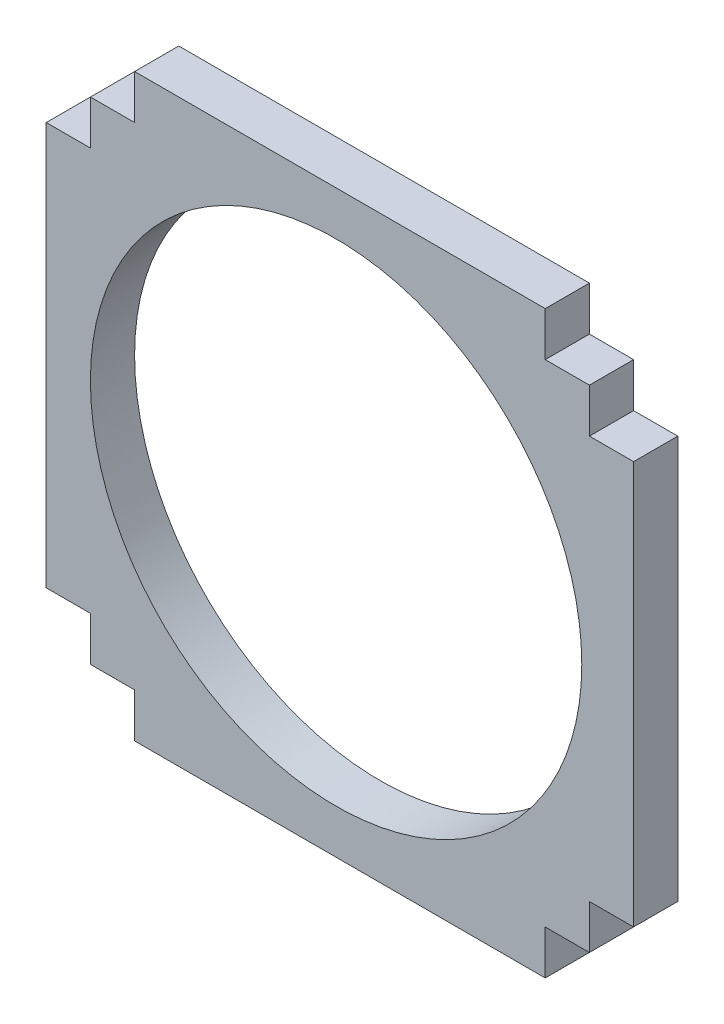
ISO-10303-21;
HEADER;
FILE_DESCRIPTION(('STEP AP214'),'2;1');
FILE_NAME('part.step','',(''),(''),'','','');
FILE_SCHEMA(('AUTOMOTIVE_DESIGN { 1 0 10303 214 1 1 1 1 }'));
ENDSEC;
DATA;
#1=APPLICATION_CONTEXT('core data for automotive mechanical design processes');
#2=APPLICATION_PROTOCOL_DEFINITION('international standard','automotive_design',2000,#1);
#3=PRODUCT_CONTEXT('',#1,'mechanical');
#4=PRODUCT('Part','Part','',(#3));
#5=PRODUCT_RELATED_PRODUCT_CATEGORY('part','',(#4));
#6=PRODUCT_DEFINITION_FORMATION('','',#4);
#7=PRODUCT_DEFINITION_CONTEXT('part definition',#1,'design');
#8=PRODUCT_DEFINITION('design','',#6,#7);
#9=PRODUCT_DEFINITION_SHAPE('','',#8);
#10=(LENGTH_UNIT() NAMED_UNIT(*) SI_UNIT(.MILLI.,.METRE.));
#11=(NAMED_UNIT(*) PLANE_ANGLE_UNIT() SI_UNIT($,.RADIAN.));
#12=(NAMED_UNIT(*) SI_UNIT($,.STERADIAN.) SOLID_ANGLE_UNIT());
#13=UNCERTAINTY_MEASURE_WITH_UNIT(LENGTH_MEASURE(1.E-05),#10,'distance_accuracy_value','');
#14=(GEOMETRIC_REPRESENTATION_CONTEXT(3) GLOBAL_UNCERTAINTY_ASSIGNED_CONTEXT((#13)) GLOBAL_UNIT_ASSIGNED_CONTEXT((#10,
#11,#12)) REPRESENTATION_CONTEXT('',''));
#15=CARTESIAN_POINT('',(0.,0.,0.));
#16=DIRECTION('',(0.,0.,1.));
#17=DIRECTION('',(1.,0.,0.));
#18=AXIS2_PLACEMENT_3D('',#15,#16,#17);
#19=CARTESIAN_POINT('',(36.4109,35.3139375,-6.35));
#20=DIRECTION('',(1.,0.,0.));
#21=DIRECTION('',(0.,0.,-1.));
#22=AXIS2_PLACEMENT_3D('',#19,#20,#21);
#23=PLANE('',#22);
#24=DIRECTION('',(0.,1.,0.));
#25=VECTOR('',#24,1.);
#26=CARTESIAN_POINT('',(36.4109,35.3139375,0.));
#27=LINE('',#26,#25);
#28=CARTESIAN_POINT('',(36.4109,28.9639375,0.));
#29=VERTEX_POINT('',#28);
#30=CARTESIAN_POINT('',(36.4109,35.3139375,0.));
#31=VERTEX_POINT('',#30);
#32=EDGE_CURVE('E204',#29,#31,#27,.T.);
#33=ORIENTED_EDGE('',*,*,#32,.F.);
#34=DIRECTION('',(0.,0.,1.));
#35=VECTOR('',#34,1.);
#36=CARTESIAN_POINT('',(36.4109,28.9639375,-6.35));
#37=LINE('',#36,#35);
#38=CARTESIAN_POINT('',(36.4109,28.9639375,-6.35));
#39=VERTEX_POINT('',#38);
#40=EDGE_CURVE('E11',#39,#29,#37,.T.);
#41=ORIENTED_EDGE('',*,*,#40,.F.);
#42=DIRECTION('',(0.,1.,0.));
#43=VECTOR('',#42,1.);
#44=CARTESIAN_POINT('',(36.4109,35.3139375,-6.35));
#45=LINE('',#44,#43);
#46=CARTESIAN_POINT('',(36.4109,35.3139375,-6.35));
#47=VERTEX_POINT('',#46);
#48=EDGE_CURVE('E261',#39,#47,#45,.T.);
#49=ORIENTED_EDGE('',*,*,#48,.T.);
#50=DIRECTION('',(0.,0.,1.));
#51=VECTOR('',#50,1.);
#52=CARTESIAN_POINT('',(36.4109,35.3139375,-6.35));
#53=LINE('',#52,#51);
#54=EDGE_CURVE('E38',#47,#31,#53,.T.);
#55=ORIENTED_EDGE('',*,*,#54,.T.);
#56=EDGE_LOOP('',(#33,#41,#49,#55));
#57=FACE_BOUND('',#56,.T.);
#58=ADVANCED_FACE('F35',(#57),#23,.T.);
#59=CARTESIAN_POINT('',(36.4109,28.9639375,-6.35));
#60=DIRECTION('',(0.,1.,0.));
#61=DIRECTION('',(0.,0.,1.));
#62=AXIS2_PLACEMENT_3D('',#59,#60,#61);
#63=PLANE('',#62);
#64=DIRECTION('',(-1.,0.,0.));
#65=VECTOR('',#64,1.);
#66=CARTESIAN_POINT('',(36.4109,28.9639375,0.));
#67=LINE('',#66,#65);
#68=CARTESIAN_POINT('',(42.7609,28.9639375,0.));
#69=VERTEX_POINT('',#68);
#70=EDGE_CURVE('E259',#69,#29,#67,.T.);
#71=ORIENTED_EDGE('',*,*,#70,.F.);
#72=DIRECTION('',(0.,0.,1.));
#73=VECTOR('',#72,1.);
#74=CARTESIAN_POINT('',(42.7609,28.9639375,-6.35));
#75=LINE('',#74,#73);
#76=CARTESIAN_POINT('',(42.7609,28.9639375,-6.35));
#77=VERTEX_POINT('',#76);
#78=EDGE_CURVE('E44',#77,#69,#75,.T.);
#79=ORIENTED_EDGE('',*,*,#78,.F.);
#80=DIRECTION('',(-1.,0.,0.));
#81=VECTOR('',#80,1.);
#82=CARTESIAN_POINT('',(36.4109,28.9639375,-6.35));
#83=LINE('',#82,#81);
#84=EDGE_CURVE('E194',#77,#39,#83,.T.);
#85=ORIENTED_EDGE('',*,*,#84,.T.);
#86=ORIENTED_EDGE('',*,*,#40,.T.);
#87=EDGE_LOOP('',(#71,#79,#85,#86));
#88=FACE_BOUND('',#87,.T.);
#89=ADVANCED_FACE('F297',(#88),#63,.T.);
#90=CARTESIAN_POINT('',(42.7609,28.9639375,-6.35));
#91=DIRECTION('',(1.,0.,0.));
#92=DIRECTION('',(0.,1.,0.));
#93=AXIS2_PLACEMENT_3D('',#90,#91,#92);
#94=PLANE('',#93);
#95=DIRECTION('',(0.,1.,0.));
#96=VECTOR('',#95,1.);
#97=CARTESIAN_POINT('',(42.7609,28.9639375,0.));
#98=LINE('',#97,#96);
#99=CARTESIAN_POINT('',(42.7609,-28.9639375,0.));
#100=VERTEX_POINT('',#99);
#101=EDGE_CURVE('E181',#100,#69,#98,.T.);
#102=ORIENTED_EDGE('',*,*,#101,.F.);
#103=DIRECTION('',(0.,0.,1.));
#104=VECTOR('',#103,1.);
#105=CARTESIAN_POINT('',(42.7609,-28.9639375,-6.35));
#106=LINE('',#105,#104);
#107=CARTESIAN_POINT('',(42.7609,-28.9639375,-6.35));
#108=VERTEX_POINT('',#107);
#109=EDGE_CURVE('E176',#108,#100,#106,.T.);
#110=ORIENTED_EDGE('',*,*,#109,.F.);
#111=DIRECTION('',(0.,1.,0.));
#112=VECTOR('',#111,1.);
#113=CARTESIAN_POINT('',(42.7609,28.9639375,-6.35));
#114=LINE('',#113,#112);
#115=EDGE_CURVE('E179',#108,#77,#114,.T.);
#116=ORIENTED_EDGE('',*,*,#115,.T.);
#117=ORIENTED_EDGE('',*,*,#78,.T.);
#118=EDGE_LOOP('',(#102,#110,#116,#117));
#119=FACE_BOUND('',#118,.T.);
#120=ADVANCED_FACE('F178',(#119),#94,.T.);
#121=CARTESIAN_POINT('',(36.4109,-28.9639375,-6.35));
#122=DIRECTION('',(0.,-1.,0.));
#123=DIRECTION('',(0.,0.,-1.));
#124=AXIS2_PLACEMENT_3D('',#121,#122,#123);
#125=PLANE('',#124);
#126=DIRECTION('',(1.,0.,0.));
#127=VECTOR('',#126,1.);
#128=CARTESIAN_POINT('',(36.4109,-28.9639375,0.));
#129=LINE('',#128,#127);
#130=CARTESIAN_POINT('',(36.4109,-28.9639375,0.));
#131=VERTEX_POINT('',#130);
#132=EDGE_CURVE('E256',#131,#100,#129,.T.);
#133=ORIENTED_EDGE('',*,*,#132,.F.);
#134=DIRECTION('',(0.,0.,1.));
#135=VECTOR('',#134,1.);
#136=CARTESIAN_POINT('',(36.4109,-28.9639375,-6.35));
#137=LINE('',#136,#135);
#138=CARTESIAN_POINT('',(36.4109,-28.9639375,-6.35));
#139=VERTEX_POINT('',#138);
#140=EDGE_CURVE('E186',#139,#131,#137,.T.);
#141=ORIENTED_EDGE('',*,*,#140,.F.);
#142=DIRECTION('',(1.,0.,0.));
#143=VECTOR('',#142,1.);
#144=CARTESIAN_POINT('',(36.4109,-28.9639375,-6.35));
#145=LINE('',#144,#143);
#146=EDGE_CURVE('E192',#139,#108,#145,.T.);
#147=ORIENTED_EDGE('',*,*,#146,.T.);
#148=ORIENTED_EDGE('',*,*,#109,.T.);
#149=EDGE_LOOP('',(#133,#141,#147,#148));
#150=FACE_BOUND('',#149,.T.);
#151=ADVANCED_FACE('F196',(#150),#125,.T.);
#152=CARTESIAN_POINT('',(36.4109,-28.9639375,-6.35));
#153=DIRECTION('',(1.,0.,0.));
#154=DIRECTION('',(0.,1.,0.));
#155=AXIS2_PLACEMENT_3D('',#152,#153,#154);
#156=PLANE('',#155);
#157=DIRECTION('',(0.,1.,0.));
#158=VECTOR('',#157,1.);
#159=CARTESIAN_POINT('',(36.4109,-28.9639375,0.));
#160=LINE('',#159,#158);
#161=CARTESIAN_POINT('',(36.4109,-35.3139375,0.));
#162=VERTEX_POINT('',#161);
#163=EDGE_CURVE('E253',#162,#131,#160,.T.);
#164=ORIENTED_EDGE('',*,*,#163,.F.);
#165=DIRECTION('',(0.,0.,1.));
#166=VECTOR('',#165,1.);
#167=CARTESIAN_POINT('',(36.4109,-35.3139375,-6.35));
#168=LINE('',#167,#166);
#169=CARTESIAN_POINT('',(36.4109,-35.3139375,-6.35));
#170=VERTEX_POINT('',#169);
#171=EDGE_CURVE('E265',#170,#162,#168,.T.);
#172=ORIENTED_EDGE('',*,*,#171,.F.);
#173=DIRECTION('',(0.,1.,0.));
#174=VECTOR('',#173,1.);
#175=CARTESIAN_POINT('',(36.4109,-28.9639375,-6.35));
#176=LINE('',#175,#174);
#177=EDGE_CURVE('E197',#170,#139,#176,.T.);
#178=ORIENTED_EDGE('',*,*,#177,.T.);
#179=ORIENTED_EDGE('',*,*,#140,.T.);
#180=EDGE_LOOP('',(#164,#172,#178,#179));
#181=FACE_BOUND('',#180,.T.);
#182=ADVANCED_FACE('F310',(#181),#156,.T.);
#183=CARTESIAN_POINT('',(36.4109,-35.3139375,-6.35));
#184=DIRECTION('',(0.,-1.,0.));
#185=DIRECTION('',(0.,0.,-1.));
#186=AXIS2_PLACEMENT_3D('',#183,#184,#185);
#187=PLANE('',#186);
#188=DIRECTION('',(1.,0.,0.));
#189=VECTOR('',#188,1.);
#190=CARTESIAN_POINT('',(36.4109,-35.3139375,0.));
#191=LINE('',#190,#189);
#192=CARTESIAN_POINT('',(30.0609,-35.3139375,0.));
#193=VERTEX_POINT('',#192);
#194=EDGE_CURVE('E250',#193,#162,#191,.T.);
#195=ORIENTED_EDGE('',*,*,#194,.F.);
#196=DIRECTION('',(0.,0.,1.));
#197=VECTOR('',#196,1.);
#198=CARTESIAN_POINT('',(30.0609,-35.3139375,-6.35));
#199=LINE('',#198,#197);
#200=CARTESIAN_POINT('',(30.0609,-35.3139375,-6.35));
#201=VERTEX_POINT('',#200);
#202=EDGE_CURVE('E267',#201,#193,#199,.T.);
#203=ORIENTED_EDGE('',*,*,#202,.F.);
#204=DIRECTION('',(1.,0.,0.));
#205=VECTOR('',#204,1.);
#206=CARTESIAN_POINT('',(36.4109,-35.3139375,-6.35));
#207=LINE('',#206,#205);
#208=EDGE_CURVE('E199',#201,#170,#207,.T.);
#209=ORIENTED_EDGE('',*,*,#208,.T.);
#210=ORIENTED_EDGE('',*,*,#171,.T.);
#211=EDGE_LOOP('',(#195,#203,#209,#210));
#212=FACE_BOUND('',#211,.T.);
#213=ADVANCED_FACE('F313',(#212),#187,.T.);
#214=CARTESIAN_POINT('',(30.0609,-35.3139375,-6.35));
#215=DIRECTION('',(1.,0.,0.));
#216=DIRECTION('',(0.,1.,0.));
#217=AXIS2_PLACEMENT_3D('',#214,#215,#216);
#218=PLANE('',#217);
#219=DIRECTION('',(0.,1.,0.));
#220=VECTOR('',#219,1.);
#221=CARTESIAN_POINT('',(30.0609,-35.3139375,0.));
#222=LINE('',#221,#220);
#223=CARTESIAN_POINT('',(30.0609,-41.6639375,0.));
#224=VERTEX_POINT('',#223);
#225=EDGE_CURVE('E247',#224,#193,#222,.T.);
#226=ORIENTED_EDGE('',*,*,#225,.F.);
#227=DIRECTION('',(0.,0.,1.));
#228=VECTOR('',#227,1.);
#229=CARTESIAN_POINT('',(30.0609,-41.6639375,-6.35));
#230=LINE('',#229,#228);
#231=CARTESIAN_POINT('',(30.0609,-41.6639375,-6.35));
#232=VERTEX_POINT('',#231);
#233=EDGE_CURVE('E269',#232,#224,#230,.T.);
#234=ORIENTED_EDGE('',*,*,#233,.F.);
#235=DIRECTION('',(0.,1.,0.));
#236=VECTOR('',#235,1.);
#237=CARTESIAN_POINT('',(30.0609,-35.3139375,-6.35));
#238=LINE('',#237,#236);
#239=EDGE_CURVE('E432',#232,#201,#238,.T.);
#240=ORIENTED_EDGE('',*,*,#239,.T.);
#241=ORIENTED_EDGE('',*,*,#202,.T.);
#242=EDGE_LOOP('',(#226,#234,#240,#241));
#243=FACE_BOUND('',#242,.T.);
#244=ADVANCED_FACE('F317',(#243),#218,.T.);
#245=CARTESIAN_POINT('',(-28.9639375,-41.6639375,-6.35));
#246=DIRECTION('',(0.,-1.,0.));
#247=DIRECTION('',(1.,0.,0.));
#248=AXIS2_PLACEMENT_3D('',#245,#246,#247);
#249=PLANE('',#248);
#250=DIRECTION('',(1.,0.,0.));
#251=VECTOR('',#250,1.);
#252=CARTESIAN_POINT('',(-28.9639375,-41.6639375,0.));
#253=LINE('',#252,#251);
#254=CARTESIAN_POINT('',(-28.9639375,-41.6639375,0.));
#255=VERTEX_POINT('',#254);
#256=EDGE_CURVE('E244',#255,#224,#253,.T.);
#257=ORIENTED_EDGE('',*,*,#256,.F.);
#258=DIRECTION('',(0.,0.,1.));
#259=VECTOR('',#258,1.);
#260=CARTESIAN_POINT('',(-28.9639375,-41.6639375,-6.35));
#261=LINE('',#260,#259);
#262=CARTESIAN_POINT('',(-28.9639375,-41.6639375,-6.35));
#263=VERTEX_POINT('',#262);
#264=EDGE_CURVE('E271',#263,#255,#261,.T.);
#265=ORIENTED_EDGE('',*,*,#264,.F.);
#266=DIRECTION('',(1.,0.,0.));
#267=VECTOR('',#266,1.);
#268=CARTESIAN_POINT('',(-28.9639375,-41.6639375,-6.35));
#269=LINE('',#268,#267);
#270=EDGE_CURVE('E429',#263,#232,#269,.T.);
#271=ORIENTED_EDGE('',*,*,#270,.T.);
#272=ORIENTED_EDGE('',*,*,#233,.T.);
#273=EDGE_LOOP('',(#257,#265,#271,#272));
#274=FACE_BOUND('',#273,.T.);
#275=ADVANCED_FACE('F321',(#274),#249,.T.);
#276=CARTESIAN_POINT('',(-28.9639375,-35.3139375,-6.35));
#277=DIRECTION('',(-1.,0.,0.));
#278=DIRECTION('',(0.,0.,1.));
#279=AXIS2_PLACEMENT_3D('',#276,#277,#278);
#280=PLANE('',#279);
#281=DIRECTION('',(0.,-1.,0.));
#282=VECTOR('',#281,1.);
#283=CARTESIAN_POINT('',(-28.9639375,-35.3139375,0.));
#284=LINE('',#283,#282);
#285=CARTESIAN_POINT('',(-28.9639375,-35.3139375,0.));
#286=VERTEX_POINT('',#285);
#287=EDGE_CURVE('E241',#286,#255,#284,.T.);
#288=ORIENTED_EDGE('',*,*,#287,.F.);
#289=DIRECTION('',(0.,0.,1.));
#290=VECTOR('',#289,1.);
#291=CARTESIAN_POINT('',(-28.9639375,-35.3139375,-6.35));
#292=LINE('',#291,#290);
#293=CARTESIAN_POINT('',(-28.9639375,-35.3139375,-6.35));
#294=VERTEX_POINT('',#293);
#295=EDGE_CURVE('E273',#294,#286,#292,.T.);
#296=ORIENTED_EDGE('',*,*,#295,.F.);
#297=DIRECTION('',(0.,-1.,0.));
#298=VECTOR('',#297,1.);
#299=CARTESIAN_POINT('',(-28.9639375,-35.3139375,-6.35));
#300=LINE('',#299,#298);
#301=EDGE_CURVE('E426',#294,#263,#300,.T.);
#302=ORIENTED_EDGE('',*,*,#301,.T.);
#303=ORIENTED_EDGE('',*,*,#264,.T.);
#304=EDGE_LOOP('',(#288,#296,#302,#303));
#305=FACE_BOUND('',#304,.T.);
#306=ADVANCED_FACE('F325',(#305),#280,.T.);
#307=CARTESIAN_POINT('',(-28.9639375,-35.3139375,-6.35));
#308=DIRECTION('',(0.,-1.,0.));
#309=DIRECTION('',(1.,0.,0.));
#310=AXIS2_PLACEMENT_3D('',#307,#308,#309);
#311=PLANE('',#310);
#312=DIRECTION('',(1.,0.,0.));
#313=VECTOR('',#312,1.);
#314=CARTESIAN_POINT('',(-28.9639375,-35.3139375,0.));
#315=LINE('',#314,#313);
#316=CARTESIAN_POINT('',(-35.3139375,-35.3139375,0.));
#317=VERTEX_POINT('',#316);
#318=EDGE_CURVE('E238',#317,#286,#315,.T.);
#319=ORIENTED_EDGE('',*,*,#318,.F.);
#320=DIRECTION('',(0.,0.,1.));
#321=VECTOR('',#320,1.);
#322=CARTESIAN_POINT('',(-35.3139375,-35.3139375,-6.35));
#323=LINE('',#322,#321);
#324=CARTESIAN_POINT('',(-35.3139375,-35.3139375,-6.35));
#325=VERTEX_POINT('',#324);
#326=EDGE_CURVE('E275',#325,#317,#323,.T.);
#327=ORIENTED_EDGE('',*,*,#326,.F.);
#328=DIRECTION('',(1.,0.,0.));
#329=VECTOR('',#328,1.);
#330=CARTESIAN_POINT('',(-28.9639375,-35.3139375,-6.35));
#331=LINE('',#330,#329);
#332=EDGE_CURVE('E423',#325,#294,#331,.T.);
#333=ORIENTED_EDGE('',*,*,#332,.T.);
#334=ORIENTED_EDGE('',*,*,#295,.T.);
#335=EDGE_LOOP('',(#319,#327,#333,#334));
#336=FACE_BOUND('',#335,.T.);
#337=ADVANCED_FACE('F329',(#336),#311,.T.);
#338=CARTESIAN_POINT('',(-35.3139375,-28.9639375,-6.35));
#339=DIRECTION('',(-1.,0.,0.));
#340=DIRECTION('',(0.,0.,1.));
#341=AXIS2_PLACEMENT_3D('',#338,#339,#340);
#342=PLANE('',#341);
#343=DIRECTION('',(0.,-1.,0.));
#344=VECTOR('',#343,1.);
#345=CARTESIAN_POINT('',(-35.3139375,-28.9639375,0.));
#346=LINE('',#345,#344);
#347=CARTESIAN_POINT('',(-35.3139375,-28.9639375,0.));
#348=VERTEX_POINT('',#347);
#349=EDGE_CURVE('E235',#348,#317,#346,.T.);
#350=ORIENTED_EDGE('',*,*,#349,.F.);
#351=DIRECTION('',(0.,0.,1.));
#352=VECTOR('',#351,1.);
#353=CARTESIAN_POINT('',(-35.3139375,-28.9639375,-6.35));
#354=LINE('',#353,#352);
#355=CARTESIAN_POINT('',(-35.3139375,-28.9639375,-6.35));
#356=VERTEX_POINT('',#355);
#357=EDGE_CURVE('E277',#356,#348,#354,.T.);
#358=ORIENTED_EDGE('',*,*,#357,.F.);
#359=DIRECTION('',(0.,-1.,0.));
#360=VECTOR('',#359,1.);
#361=CARTESIAN_POINT('',(-35.3139375,-28.9639375,-6.35));
#362=LINE('',#361,#360);
#363=EDGE_CURVE('E420',#356,#325,#362,.T.);
#364=ORIENTED_EDGE('',*,*,#363,.T.);
#365=ORIENTED_EDGE('',*,*,#326,.T.);
#366=EDGE_LOOP('',(#350,#358,#364,#365));
#367=FACE_BOUND('',#366,.T.);
#368=ADVANCED_FACE('F333',(#367),#342,.T.);
#369=CARTESIAN_POINT('',(-35.3139375,-28.9639375,-6.35));
#370=DIRECTION('',(0.,-1.,0.));
#371=DIRECTION('',(1.,0.,0.));
#372=AXIS2_PLACEMENT_3D('',#369,#370,#371);
#373=PLANE('',#372);
#374=DIRECTION('',(1.,0.,0.));
#375=VECTOR('',#374,1.);
#376=CARTESIAN_POINT('',(-35.3139375,-28.9639375,0.));
#377=LINE('',#376,#375);
#378=CARTESIAN_POINT('',(-41.6639375,-28.9639375,0.));
#379=VERTEX_POINT('',#378);
#380=EDGE_CURVE('E232',#379,#348,#377,.T.);
#381=ORIENTED_EDGE('',*,*,#380,.F.);
#382=DIRECTION('',(0.,0.,1.));
#383=VECTOR('',#382,1.);
#384=CARTESIAN_POINT('',(-41.6639375,-28.9639375,-6.35));
#385=LINE('',#384,#383);
#386=CARTESIAN_POINT('',(-41.6639375,-28.9639375,-6.35));
#387=VERTEX_POINT('',#386);
#388=EDGE_CURVE('E279',#387,#379,#385,.T.);
#389=ORIENTED_EDGE('',*,*,#388,.F.);
#390=DIRECTION('',(1.,0.,0.));
#391=VECTOR('',#390,1.);
#392=CARTESIAN_POINT('',(-35.3139375,-28.9639375,-6.35));
#393=LINE('',#392,#391);
#394=EDGE_CURVE('E417',#387,#356,#393,.T.);
#395=ORIENTED_EDGE('',*,*,#394,.T.);
#396=ORIENTED_EDGE('',*,*,#357,.T.);
#397=EDGE_LOOP('',(#381,#389,#395,#396));
#398=FACE_BOUND('',#397,.T.);
#399=ADVANCED_FACE('F337',(#398),#373,.T.);
#400=CARTESIAN_POINT('',(-41.6639375,28.9639375,-6.35));
#401=DIRECTION('',(-1.,0.,0.));
#402=DIRECTION('',(0.,-1.,0.));
#403=AXIS2_PLACEMENT_3D('',#400,#401,#402);
#404=PLANE('',#403);
#405=DIRECTION('',(0.,-1.,0.));
#406=VECTOR('',#405,1.);
#407=CARTESIAN_POINT('',(-41.6639375,28.9639375,0.));
#408=LINE('',#407,#406);
#409=CARTESIAN_POINT('',(-41.6639375,28.9639375,0.));
#410=VERTEX_POINT('',#409);
#411=EDGE_CURVE('E229',#410,#379,#408,.T.);
#412=ORIENTED_EDGE('',*,*,#411,.F.);
#413=DIRECTION('',(0.,0.,1.));
#414=VECTOR('',#413,1.);
#415=CARTESIAN_POINT('',(-41.6639375,28.9639375,-6.35));
#416=LINE('',#415,#414);
#417=CARTESIAN_POINT('',(-41.6639375,28.9639375,-6.35));
#418=VERTEX_POINT('',#417);
#419=EDGE_CURVE('E281',#418,#410,#416,.T.);
#420=ORIENTED_EDGE('',*,*,#419,.F.);
#421=DIRECTION('',(0.,-1.,0.));
#422=VECTOR('',#421,1.);
#423=CARTESIAN_POINT('',(-41.6639375,28.9639375,-6.35));
#424=LINE('',#423,#422);
#425=EDGE_CURVE('E414',#418,#387,#424,.T.);
#426=ORIENTED_EDGE('',*,*,#425,.T.);
#427=ORIENTED_EDGE('',*,*,#388,.T.);
#428=EDGE_LOOP('',(#412,#420,#426,#427));
#429=FACE_BOUND('',#428,.T.);
#430=ADVANCED_FACE('F341',(#429),#404,.T.);
#431=CARTESIAN_POINT('',(-35.3139375,28.9639375,-6.35));
#432=DIRECTION('',(0.,1.,0.));
#433=DIRECTION('',(-1.,0.,0.));
#434=AXIS2_PLACEMENT_3D('',#431,#432,#433);
#435=PLANE('',#434);
#436=DIRECTION('',(-1.,0.,0.));
#437=VECTOR('',#436,1.);
#438=CARTESIAN_POINT('',(-35.3139375,28.9639375,0.));
#439=LINE('',#438,#437);
#440=CARTESIAN_POINT('',(-35.3139375,28.9639375,0.));
#441=VERTEX_POINT('',#440);
#442=EDGE_CURVE('E226',#441,#410,#439,.T.);
#443=ORIENTED_EDGE('',*,*,#442,.F.);
#444=DIRECTION('',(0.,0.,1.));
#445=VECTOR('',#444,1.);
#446=CARTESIAN_POINT('',(-35.3139375,28.9639375,-6.35));
#447=LINE('',#446,#445);
#448=CARTESIAN_POINT('',(-35.3139375,28.9639375,-6.35));
#449=VERTEX_POINT('',#448);
#450=EDGE_CURVE('E283',#449,#441,#447,.T.);
#451=ORIENTED_EDGE('',*,*,#450,.F.);
#452=DIRECTION('',(-1.,0.,0.));
#453=VECTOR('',#452,1.);
#454=CARTESIAN_POINT('',(-35.3139375,28.9639375,-6.35));
#455=LINE('',#454,#453);
#456=EDGE_CURVE('E411',#449,#418,#455,.T.);
#457=ORIENTED_EDGE('',*,*,#456,.T.);
#458=ORIENTED_EDGE('',*,*,#419,.T.);
#459=EDGE_LOOP('',(#443,#451,#457,#458));
#460=FACE_BOUND('',#459,.T.);
#461=ADVANCED_FACE('F345',(#460),#435,.T.);
#462=CARTESIAN_POINT('',(-35.3139375,35.3139375,-6.35));
#463=DIRECTION('',(-1.,0.,0.));
#464=DIRECTION('',(0.,0.,1.));
#465=AXIS2_PLACEMENT_3D('',#462,#463,#464);
#466=PLANE('',#465);
#467=DIRECTION('',(0.,-1.,0.));
#468=VECTOR('',#467,1.);
#469=CARTESIAN_POINT('',(-35.3139375,35.3139375,0.));
#470=LINE('',#469,#468);
#471=CARTESIAN_POINT('',(-35.3139375,35.3139375,0.));
#472=VERTEX_POINT('',#471);
#473=EDGE_CURVE('E223',#472,#441,#470,.T.);
#474=ORIENTED_EDGE('',*,*,#473,.F.);
#475=DIRECTION('',(0.,0.,1.));
#476=VECTOR('',#475,1.);
#477=CARTESIAN_POINT('',(-35.3139375,35.3139375,-6.35));
#478=LINE('',#477,#476);
#479=CARTESIAN_POINT('',(-35.3139375,35.3139375,-6.35));
#480=VERTEX_POINT('',#479);
#481=EDGE_CURVE('E285',#480,#472,#478,.T.);
#482=ORIENTED_EDGE('',*,*,#481,.F.);
#483=DIRECTION('',(0.,-1.,0.));
#484=VECTOR('',#483,1.);
#485=CARTESIAN_POINT('',(-35.3139375,35.3139375,-6.35));
#486=LINE('',#485,#484);
#487=EDGE_CURVE('E408',#480,#449,#486,.T.);
#488=ORIENTED_EDGE('',*,*,#487,.T.);
#489=ORIENTED_EDGE('',*,*,#450,.T.);
#490=EDGE_LOOP('',(#474,#482,#488,#489));
#491=FACE_BOUND('',#490,.T.);
#492=ADVANCED_FACE('F349',(#491),#466,.T.);
#493=CARTESIAN_POINT('',(-28.9639375,35.3139375,-6.35));
#494=DIRECTION('',(0.,1.,0.));
#495=DIRECTION('',(-1.,0.,0.));
#496=AXIS2_PLACEMENT_3D('',#493,#494,#495);
#497=PLANE('',#496);
#498=DIRECTION('',(-1.,0.,0.));
#499=VECTOR('',#498,1.);
#500=CARTESIAN_POINT('',(-28.9639375,35.3139375,0.));
#501=LINE('',#500,#499);
#502=CARTESIAN_POINT('',(-28.9639375,35.3139375,0.));
#503=VERTEX_POINT('',#502);
#504=EDGE_CURVE('E220',#503,#472,#501,.T.);
#505=ORIENTED_EDGE('',*,*,#504,.F.);
#506=DIRECTION('',(0.,0.,1.));
#507=VECTOR('',#506,1.);
#508=CARTESIAN_POINT('',(-28.9639375,35.3139375,-6.35));
#509=LINE('',#508,#507);
#510=CARTESIAN_POINT('',(-28.9639375,35.3139375,-6.35));
#511=VERTEX_POINT('',#510);
#512=EDGE_CURVE('E287',#511,#503,#509,.T.);
#513=ORIENTED_EDGE('',*,*,#512,.F.);
#514=DIRECTION('',(-1.,0.,0.));
#515=VECTOR('',#514,1.);
#516=CARTESIAN_POINT('',(-28.9639375,35.3139375,-6.35));
#517=LINE('',#516,#515);
#518=EDGE_CURVE('E405',#511,#480,#517,.T.);
#519=ORIENTED_EDGE('',*,*,#518,.T.);
#520=ORIENTED_EDGE('',*,*,#481,.T.);
#521=EDGE_LOOP('',(#505,#513,#519,#520));
#522=FACE_BOUND('',#521,.T.);
#523=ADVANCED_FACE('F353',(#522),#497,.T.);
#524=CARTESIAN_POINT('',(-28.9639375,35.3139375,-6.35));
#525=DIRECTION('',(-1.,0.,0.));
#526=DIRECTION('',(0.,0.,1.));
#527=AXIS2_PLACEMENT_3D('',#524,#525,#526);
#528=PLANE('',#527);
#529=DIRECTION('',(0.,-1.,0.));
#530=VECTOR('',#529,1.);
#531=CARTESIAN_POINT('',(-28.9639375,35.3139375,0.));
#532=LINE('',#531,#530);
#533=CARTESIAN_POINT('',(-28.9639375,41.6639375,0.));
#534=VERTEX_POINT('',#533);
#535=EDGE_CURVE('E217',#534,#503,#532,.T.);
#536=ORIENTED_EDGE('',*,*,#535,.F.);
#537=DIRECTION('',(0.,0.,1.));
#538=VECTOR('',#537,1.);
#539=CARTESIAN_POINT('',(-28.9639375,41.6639375,-6.35));
#540=LINE('',#539,#538);
#541=CARTESIAN_POINT('',(-28.9639375,41.6639375,-6.35));
#542=VERTEX_POINT('',#541);
#543=EDGE_CURVE('E289',#542,#534,#540,.T.);
#544=ORIENTED_EDGE('',*,*,#543,.F.);
#545=DIRECTION('',(0.,-1.,0.));
#546=VECTOR('',#545,1.);
#547=CARTESIAN_POINT('',(-28.9639375,35.3139375,-6.35));
#548=LINE('',#547,#546);
#549=EDGE_CURVE('E402',#542,#511,#548,.T.);
#550=ORIENTED_EDGE('',*,*,#549,.T.);
#551=ORIENTED_EDGE('',*,*,#512,.T.);
#552=EDGE_LOOP('',(#536,#544,#550,#551));
#553=FACE_BOUND('',#552,.T.);
#554=ADVANCED_FACE('F357',(#553),#528,.T.);
#555=CARTESIAN_POINT('',(-28.9639375,41.6639375,-6.35));
#556=DIRECTION('',(0.,1.,0.));
#557=DIRECTION('',(0.,0.,1.));
#558=AXIS2_PLACEMENT_3D('',#555,#556,#557);
#559=PLANE('',#558);
#560=DIRECTION('',(-1.,0.,0.));
#561=VECTOR('',#560,1.);
#562=CARTESIAN_POINT('',(-28.9639375,41.6639375,0.));
#563=LINE('',#562,#561);
#564=CARTESIAN_POINT('',(30.0609,41.6639375,0.));
#565=VERTEX_POINT('',#564);
#566=EDGE_CURVE('E214',#565,#534,#563,.T.);
#567=ORIENTED_EDGE('',*,*,#566,.F.);
#568=DIRECTION('',(0.,0.,1.));
#569=VECTOR('',#568,1.);
#570=CARTESIAN_POINT('',(30.0609,41.6639375,-6.35));
#571=LINE('',#570,#569);
#572=CARTESIAN_POINT('',(30.0609,41.6639375,-6.35));
#573=VERTEX_POINT('',#572);
#574=EDGE_CURVE('E291',#573,#565,#571,.T.);
#575=ORIENTED_EDGE('',*,*,#574,.F.);
#576=DIRECTION('',(-1.,0.,0.));
#577=VECTOR('',#576,1.);
#578=CARTESIAN_POINT('',(-28.9639375,41.6639375,-6.35));
#579=LINE('',#578,#577);
#580=EDGE_CURVE('E399',#573,#542,#579,.T.);
#581=ORIENTED_EDGE('',*,*,#580,.T.);
#582=ORIENTED_EDGE('',*,*,#543,.T.);
#583=EDGE_LOOP('',(#567,#575,#581,#582));
#584=FACE_BOUND('',#583,.T.);
#585=ADVANCED_FACE('F361',(#584),#559,.T.);
#586=CARTESIAN_POINT('',(30.0609,35.3139375,-6.35));
#587=DIRECTION('',(1.,0.,0.));
#588=DIRECTION('',(0.,1.,0.));
#589=AXIS2_PLACEMENT_3D('',#586,#587,#588);
#590=PLANE('',#589);
#591=DIRECTION('',(0.,1.,0.));
#592=VECTOR('',#591,1.);
#593=CARTESIAN_POINT('',(30.0609,35.3139375,0.));
#594=LINE('',#593,#592);
#595=CARTESIAN_POINT('',(30.0609,35.3139375,0.));
#596=VERTEX_POINT('',#595);
#597=EDGE_CURVE('E211',#596,#565,#594,.T.);
#598=ORIENTED_EDGE('',*,*,#597,.F.);
#599=DIRECTION('',(0.,0.,1.));
#600=VECTOR('',#599,1.);
#601=CARTESIAN_POINT('',(30.0609,35.3139375,-6.35));
#602=LINE('',#601,#600);
#603=CARTESIAN_POINT('',(30.0609,35.3139375,-6.35));
#604=VERTEX_POINT('',#603);
#605=EDGE_CURVE('E292',#604,#596,#602,.T.);
#606=ORIENTED_EDGE('',*,*,#605,.F.);
#607=DIRECTION('',(0.,1.,0.));
#608=VECTOR('',#607,1.);
#609=CARTESIAN_POINT('',(30.0609,35.3139375,-6.35));
#610=LINE('',#609,#608);
#611=EDGE_CURVE('E396',#604,#573,#610,.T.);
#612=ORIENTED_EDGE('',*,*,#611,.T.);
#613=ORIENTED_EDGE('',*,*,#574,.T.);
#614=EDGE_LOOP('',(#598,#606,#612,#613));
#615=FACE_BOUND('',#614,.T.);
#616=ADVANCED_FACE('F365',(#615),#590,.T.);
#617=CARTESIAN_POINT('',(36.4109,35.3139375,-6.35));
#618=DIRECTION('',(0.,1.,0.));
#619=DIRECTION('',(-1.,0.,0.));
#620=AXIS2_PLACEMENT_3D('',#617,#618,#619);
#621=PLANE('',#620);
#622=DIRECTION('',(-1.,0.,0.));
#623=VECTOR('',#622,1.);
#624=CARTESIAN_POINT('',(36.4109,35.3139375,0.));
#625=LINE('',#624,#623);
#626=EDGE_CURVE('E207',#31,#596,#625,.T.);
#627=ORIENTED_EDGE('',*,*,#626,.F.);
#628=ORIENTED_EDGE('',*,*,#54,.F.);
#629=DIRECTION('',(-1.,0.,0.));
#630=VECTOR('',#629,1.);
#631=CARTESIAN_POINT('',(36.4109,35.3139375,-6.35));
#632=LINE('',#631,#630);
#633=EDGE_CURVE('E394',#47,#604,#632,.T.);
#634=ORIENTED_EDGE('',*,*,#633,.T.);
#635=ORIENTED_EDGE('',*,*,#605,.T.);
#636=EDGE_LOOP('',(#627,#628,#634,#635));
#637=FACE_BOUND('',#636,.T.);
#638=ADVANCED_FACE('F294',(#637),#621,.T.);
#639=CARTESIAN_POINT('',(0.,0.,-6.35));
#640=DIRECTION('',(0.,0.,1.));
#641=DIRECTION('',(1.,0.,0.));
#642=AXIS2_PLACEMENT_3D('',#639,#640,#641);
#643=PLANE('',#642);
#644=CARTESIAN_POINT('',(0.,0.,-6.35));
#645=DIRECTION('',(0.,0.,1.));
#646=DIRECTION('',(1.,0.,0.));
#647=AXIS2_PLACEMENT_3D('',#644,#645,#646);
#648=CIRCLE('',#647,35.3139375);
#649=CARTESIAN_POINT('',(35.3139375,0.,-6.35));
#650=VERTEX_POINT('',#649);
#651=EDGE_CURVE('E208',#650,#650,#648,.T.);
#652=ORIENTED_EDGE('',*,*,#651,.T.);
#653=EDGE_LOOP('',(#652));
#654=FACE_BOUND('',#653,.T.);
#655=ORIENTED_EDGE('',*,*,#48,.F.);
#656=ORIENTED_EDGE('',*,*,#84,.F.);
#657=ORIENTED_EDGE('',*,*,#115,.F.);
#658=ORIENTED_EDGE('',*,*,#146,.F.);
#659=ORIENTED_EDGE('',*,*,#177,.F.);
#660=ORIENTED_EDGE('',*,*,#208,.F.);
#661=ORIENTED_EDGE('',*,*,#239,.F.);
#662=ORIENTED_EDGE('',*,*,#270,.F.);
#663=ORIENTED_EDGE('',*,*,#301,.F.);
#664=ORIENTED_EDGE('',*,*,#332,.F.);
#665=ORIENTED_EDGE('',*,*,#363,.F.);
#666=ORIENTED_EDGE('',*,*,#394,.F.);
#667=ORIENTED_EDGE('',*,*,#425,.F.);
#668=ORIENTED_EDGE('',*,*,#456,.F.);
#669=ORIENTED_EDGE('',*,*,#487,.F.);
#670=ORIENTED_EDGE('',*,*,#518,.F.);
#671=ORIENTED_EDGE('',*,*,#549,.F.);
#672=ORIENTED_EDGE('',*,*,#580,.F.);
#673=ORIENTED_EDGE('',*,*,#611,.F.);
#674=ORIENTED_EDGE('',*,*,#633,.F.);
#675=EDGE_LOOP('',(#655,#656,#657,#658,#659,#660,#661,#662,#663,#664,#665,#666,#667,#668,#669,
#670,#671,#672,#673,#674));
#676=FACE_BOUND('',#675,.T.);
#677=ADVANCED_FACE('F190',(#654,#676),#643,.F.);
#678=CARTESIAN_POINT('',(0.,0.,0.));
#679=DIRECTION('',(0.,0.,1.));
#680=DIRECTION('',(1.,0.,0.));
#681=AXIS2_PLACEMENT_3D('',#678,#679,#680);
#682=PLANE('',#681);
#683=CARTESIAN_POINT('',(0.,0.,0.));
#684=DIRECTION('',(0.,0.,1.));
#685=DIRECTION('',(1.,0.,0.));
#686=AXIS2_PLACEMENT_3D('',#683,#684,#685);
#687=CIRCLE('',#686,35.3139375);
#688=CARTESIAN_POINT('',(35.3139375,0.,0.));
#689=VERTEX_POINT('',#688);
#690=EDGE_CURVE('E389',#689,#689,#687,.T.);
#691=ORIENTED_EDGE('',*,*,#690,.F.);
#692=EDGE_LOOP('',(#691));
#693=FACE_BOUND('',#692,.T.);
#694=ORIENTED_EDGE('',*,*,#32,.T.);
#695=ORIENTED_EDGE('',*,*,#626,.T.);
#696=ORIENTED_EDGE('',*,*,#597,.T.);
#697=ORIENTED_EDGE('',*,*,#566,.T.);
#698=ORIENTED_EDGE('',*,*,#535,.T.);
#699=ORIENTED_EDGE('',*,*,#504,.T.);
#700=ORIENTED_EDGE('',*,*,#473,.T.);
#701=ORIENTED_EDGE('',*,*,#442,.T.);
#702=ORIENTED_EDGE('',*,*,#411,.T.);
#703=ORIENTED_EDGE('',*,*,#380,.T.);
#704=ORIENTED_EDGE('',*,*,#349,.T.);
#705=ORIENTED_EDGE('',*,*,#318,.T.);
#706=ORIENTED_EDGE('',*,*,#287,.T.);
#707=ORIENTED_EDGE('',*,*,#256,.T.);
#708=ORIENTED_EDGE('',*,*,#225,.T.);
#709=ORIENTED_EDGE('',*,*,#194,.T.);
#710=ORIENTED_EDGE('',*,*,#163,.T.);
#711=ORIENTED_EDGE('',*,*,#132,.T.);
#712=ORIENTED_EDGE('',*,*,#101,.T.);
#713=ORIENTED_EDGE('',*,*,#70,.T.);
#714=EDGE_LOOP('',(#694,#695,#696,#697,#698,#699,#700,#701,#702,#703,#704,#705,#706,#707,#708,
#709,#710,#711,#712,#713));
#715=FACE_BOUND('',#714,.T.);
#716=ADVANCED_FACE('F296',(#693,#715),#682,.T.);
#717=CARTESIAN_POINT('',(0.,0.,-6.35));
#718=DIRECTION('',(0.,0.,1.));
#719=DIRECTION('',(1.,0.,0.));
#720=AXIS2_PLACEMENT_3D('',#717,#718,#719);
#721=CYLINDRICAL_SURFACE('',#720,35.3139375);
#722=ORIENTED_EDGE('',*,*,#651,.F.);
#723=EDGE_LOOP('',(#722));
#724=FACE_BOUND('',#723,.T.);
#725=ORIENTED_EDGE('',*,*,#690,.T.);
#726=EDGE_LOOP('',(#725));
#727=FACE_BOUND('',#726,.T.);
#728=ADVANCED_FACE('F377',(#724,#727),#721,.F.);
#729=CLOSED_SHELL('',(#58,#89,#120,#151,#182,#213,#244,#275,#306,#337,#368,#399,#430,#461,#492,
#523,#554,#585,#616,#638,#677,#716,#728));
#730=MANIFOLD_SOLID_BREP('B2',#729);
#731=ADVANCED_BREP_SHAPE_REPRESENTATION('',(#18,#730),#14);
#732=SHAPE_DEFINITION_REPRESENTATION(#9,#731);
ENDSEC;
END-ISO-10303-21;
